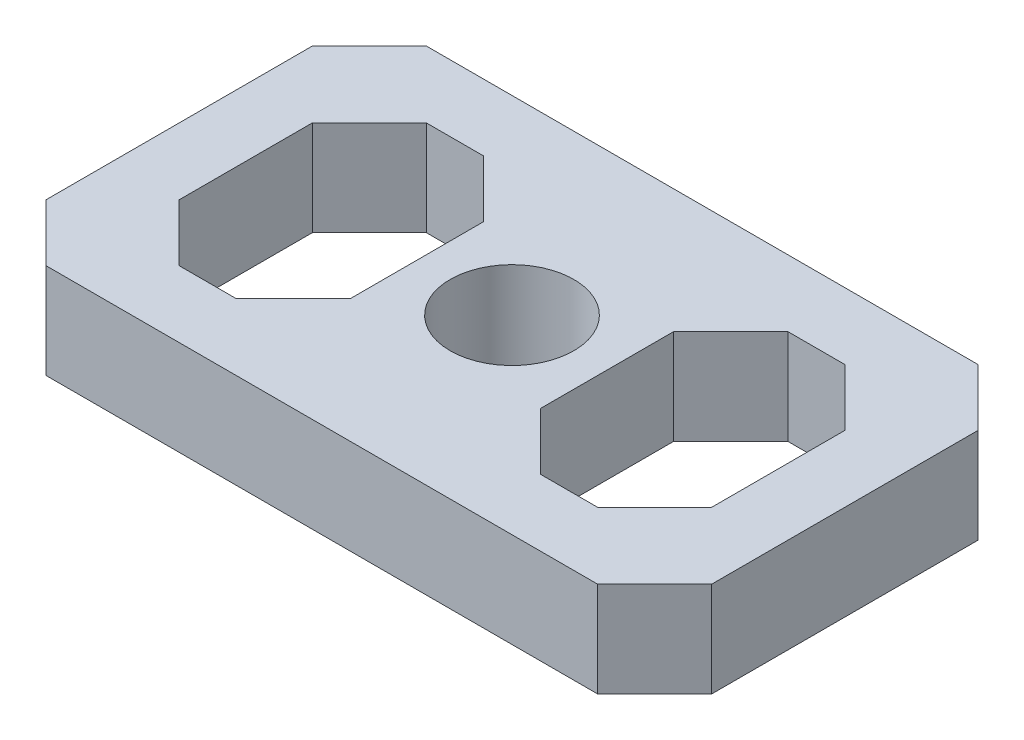
ISO-10303-21;
HEADER;
FILE_DESCRIPTION(('STEP AP214'),'2;1');
FILE_NAME('part.step','',(''),(''),'','','');
FILE_SCHEMA(('AUTOMOTIVE_DESIGN { 1 0 10303 214 1 1 1 1 }'));
ENDSEC;
DATA;
#1=APPLICATION_CONTEXT('core data for automotive mechanical design processes');
#2=APPLICATION_PROTOCOL_DEFINITION('international standard','automotive_design',2000,#1);
#3=PRODUCT_CONTEXT('',#1,'mechanical');
#4=PRODUCT('Part','Part','',(#3));
#5=PRODUCT_RELATED_PRODUCT_CATEGORY('part','',(#4));
#6=PRODUCT_DEFINITION_FORMATION('','',#4);
#7=PRODUCT_DEFINITION_CONTEXT('part definition',#1,'design');
#8=PRODUCT_DEFINITION('design','',#6,#7);
#9=PRODUCT_DEFINITION_SHAPE('','',#8);
#10=(LENGTH_UNIT() NAMED_UNIT(*) SI_UNIT(.MILLI.,.METRE.));
#11=(NAMED_UNIT(*) PLANE_ANGLE_UNIT() SI_UNIT($,.RADIAN.));
#12=(NAMED_UNIT(*) SI_UNIT($,.STERADIAN.) SOLID_ANGLE_UNIT());
#13=UNCERTAINTY_MEASURE_WITH_UNIT(LENGTH_MEASURE(1.E-05),#10,'distance_accuracy_value','');
#14=(GEOMETRIC_REPRESENTATION_CONTEXT(3) GLOBAL_UNCERTAINTY_ASSIGNED_CONTEXT((#13)) GLOBAL_UNIT_ASSIGNED_CONTEXT((#10,
#11,#12)) REPRESENTATION_CONTEXT('',''));
#15=CARTESIAN_POINT('',(0.,0.,0.));
#16=DIRECTION('',(0.,0.,1.));
#17=DIRECTION('',(1.,0.,0.));
#18=AXIS2_PLACEMENT_3D('',#15,#16,#17);
#19=CARTESIAN_POINT('',(0.,10.,0.));
#20=DIRECTION('',(0.,1.,0.));
#21=DIRECTION('',(0.,0.,1.));
#22=AXIS2_PLACEMENT_3D('',#19,#20,#21);
#23=PLANE('',#22);
#24=DIRECTION('',(-1.,0.,0.));
#25=VECTOR('',#24,1.);
#26=CARTESIAN_POINT('',(-35.,10.,-20.));
#27=LINE('',#26,#25);
#28=CARTESIAN_POINT('',(29.,10.,-20.));
#29=VERTEX_POINT('',#28);
#30=CARTESIAN_POINT('',(-29.,10.,-20.));
#31=VERTEX_POINT('',#30);
#32=EDGE_CURVE('E396',#29,#31,#27,.T.);
#33=ORIENTED_EDGE('',*,*,#32,.T.);
#34=DIRECTION('',(0.707106781186549,0.,-0.707106781186546));
#35=VECTOR('',#34,1.);
#36=CARTESIAN_POINT('',(-24.4999999999999,10.,-24.5));
#37=LINE('',#36,#35);
#38=CARTESIAN_POINT('',(-35.,10.,-14.));
#39=VERTEX_POINT('',#38);
#40=EDGE_CURVE('E250',#31,#39,#37,.F.);
#41=ORIENTED_EDGE('',*,*,#40,.T.);
#42=DIRECTION('',(0.,0.,1.));
#43=VECTOR('',#42,1.);
#44=CARTESIAN_POINT('',(-35.,10.,-20.));
#45=LINE('',#44,#43);
#46=CARTESIAN_POINT('',(-35.,10.,14.));
#47=VERTEX_POINT('',#46);
#48=EDGE_CURVE('E218',#39,#47,#45,.T.);
#49=ORIENTED_EDGE('',*,*,#48,.T.);
#50=DIRECTION('',(-0.707106781186546,0.,-0.707106781186549));
#51=VECTOR('',#50,1.);
#52=CARTESIAN_POINT('',(-24.5000000000001,10.,24.5));
#53=LINE('',#52,#51);
#54=CARTESIAN_POINT('',(-29.,10.,20.));
#55=VERTEX_POINT('',#54);
#56=EDGE_CURVE('E248',#47,#55,#53,.F.);
#57=ORIENTED_EDGE('',*,*,#56,.T.);
#58=DIRECTION('',(1.,0.,0.));
#59=VECTOR('',#58,1.);
#60=CARTESIAN_POINT('',(-35.,10.,20.));
#61=LINE('',#60,#59);
#62=CARTESIAN_POINT('',(29.,10.,20.));
#63=VERTEX_POINT('',#62);
#64=EDGE_CURVE('E235',#55,#63,#61,.T.);
#65=ORIENTED_EDGE('',*,*,#64,.T.);
#66=DIRECTION('',(-0.707106781186549,0.,0.707106781186546));
#67=VECTOR('',#66,1.);
#68=CARTESIAN_POINT('',(24.4999999999999,10.,24.5));
#69=LINE('',#68,#67);
#70=CARTESIAN_POINT('',(35.,10.,14.));
#71=VERTEX_POINT('',#70);
#72=EDGE_CURVE('E246',#63,#71,#69,.F.);
#73=ORIENTED_EDGE('',*,*,#72,.T.);
#74=DIRECTION('',(0.,0.,-1.));
#75=VECTOR('',#74,1.);
#76=CARTESIAN_POINT('',(35.,10.,-20.));
#77=LINE('',#76,#75);
#78=CARTESIAN_POINT('',(35.,10.,-14.));
#79=VERTEX_POINT('',#78);
#80=EDGE_CURVE('E229',#71,#79,#77,.T.);
#81=ORIENTED_EDGE('',*,*,#80,.T.);
#82=DIRECTION('',(0.707106781186546,0.,0.707106781186549));
#83=VECTOR('',#82,1.);
#84=CARTESIAN_POINT('',(24.5000000000001,10.,-24.5));
#85=LINE('',#84,#83);
#86=EDGE_CURVE('E244',#79,#29,#85,.F.);
#87=ORIENTED_EDGE('',*,*,#86,.T.);
#88=EDGE_LOOP('',(#33,#41,#49,#57,#65,#73,#81,#87));
#89=FACE_BOUND('',#88,.T.);
#90=CARTESIAN_POINT('',(0.,10.,0.));
#91=DIRECTION('',(0.,1.,0.));
#92=DIRECTION('',(0.,0.,1.));
#93=AXIS2_PLACEMENT_3D('',#90,#91,#92);
#94=CIRCLE('',#93,6.5);
#95=CARTESIAN_POINT('',(0.,10.,6.5));
#96=VERTEX_POINT('',#95);
#97=EDGE_CURVE('E389',#96,#96,#94,.T.);
#98=ORIENTED_EDGE('',*,*,#97,.F.);
#99=EDGE_LOOP('',(#98));
#100=FACE_BOUND('',#99,.T.);
#101=DIRECTION('',(-1.,0.,0.));
#102=VECTOR('',#101,1.);
#103=CARTESIAN_POINT('',(-28.,10.,-13.));
#104=LINE('',#103,#102);
#105=CARTESIAN_POINT('',(-16.,10.,-13.));
#106=VERTEX_POINT('',#105);
#107=CARTESIAN_POINT('',(-22.,10.,-13.));
#108=VERTEX_POINT('',#107);
#109=EDGE_CURVE('E368',#106,#108,#104,.T.);
#110=ORIENTED_EDGE('',*,*,#109,.F.);
#111=DIRECTION('',(-0.707106781186544,0.,-0.707106781186551));
#112=VECTOR('',#111,1.);
#113=CARTESIAN_POINT('',(-10.,10.,-6.99999999999997));
#114=LINE('',#113,#112);
#115=CARTESIAN_POINT('',(-10.,10.,-6.99999999999997));
#116=VERTEX_POINT('',#115);
#117=EDGE_CURVE('E307',#106,#116,#114,.F.);
#118=ORIENTED_EDGE('',*,*,#117,.T.);
#119=DIRECTION('',(0.,0.,-1.));
#120=VECTOR('',#119,1.);
#121=CARTESIAN_POINT('',(-10.,10.,-13.));
#122=LINE('',#121,#120);
#123=CARTESIAN_POINT('',(-10.,10.,7.00000000000001));
#124=VERTEX_POINT('',#123);
#125=EDGE_CURVE('E365',#124,#116,#122,.T.);
#126=ORIENTED_EDGE('',*,*,#125,.F.);
#127=DIRECTION('',(0.707106781186551,0.,-0.707106781186544));
#128=VECTOR('',#127,1.);
#129=CARTESIAN_POINT('',(-16.,10.,13.));
#130=LINE('',#129,#128);
#131=CARTESIAN_POINT('',(-16.,10.,13.));
#132=VERTEX_POINT('',#131);
#133=EDGE_CURVE('E311',#124,#132,#130,.F.);
#134=ORIENTED_EDGE('',*,*,#133,.T.);
#135=DIRECTION('',(1.,0.,0.));
#136=VECTOR('',#135,1.);
#137=CARTESIAN_POINT('',(-28.,10.,13.));
#138=LINE('',#137,#136);
#139=CARTESIAN_POINT('',(-22.,10.,13.));
#140=VERTEX_POINT('',#139);
#141=EDGE_CURVE('E375',#140,#132,#138,.T.);
#142=ORIENTED_EDGE('',*,*,#141,.F.);
#143=DIRECTION('',(0.707106781186544,0.,0.707106781186551));
#144=VECTOR('',#143,1.);
#145=CARTESIAN_POINT('',(-28.,10.,6.99999999999997));
#146=LINE('',#145,#144);
#147=CARTESIAN_POINT('',(-28.,10.,6.99999999999997));
#148=VERTEX_POINT('',#147);
#149=EDGE_CURVE('E315',#140,#148,#146,.F.);
#150=ORIENTED_EDGE('',*,*,#149,.T.);
#151=DIRECTION('',(0.,0.,1.));
#152=VECTOR('',#151,1.);
#153=CARTESIAN_POINT('',(-28.,10.,-13.));
#154=LINE('',#153,#152);
#155=CARTESIAN_POINT('',(-28.,10.,-7.00000000000002));
#156=VERTEX_POINT('',#155);
#157=EDGE_CURVE('E372',#156,#148,#154,.T.);
#158=ORIENTED_EDGE('',*,*,#157,.F.);
#159=DIRECTION('',(-0.707106781186551,0.,0.707106781186544));
#160=VECTOR('',#159,1.);
#161=CARTESIAN_POINT('',(-22.,10.,-13.));
#162=LINE('',#161,#160);
#163=EDGE_CURVE('E303',#156,#108,#162,.F.);
#164=ORIENTED_EDGE('',*,*,#163,.T.);
#165=EDGE_LOOP('',(#110,#118,#126,#134,#142,#150,#158,#164));
#166=FACE_BOUND('',#165,.T.);
#167=DIRECTION('',(-1.,0.,0.));
#168=VECTOR('',#167,1.);
#169=CARTESIAN_POINT('',(10.,10.,-13.));
#170=LINE('',#169,#168);
#171=CARTESIAN_POINT('',(22.,10.,-13.));
#172=VERTEX_POINT('',#171);
#173=CARTESIAN_POINT('',(16.,10.,-13.));
#174=VERTEX_POINT('',#173);
#175=EDGE_CURVE('E344',#172,#174,#170,.T.);
#176=ORIENTED_EDGE('',*,*,#175,.F.);
#177=DIRECTION('',(-0.707106781186544,0.,-0.707106781186551));
#178=VECTOR('',#177,1.);
#179=CARTESIAN_POINT('',(28.,10.,-6.99999999999996));
#180=LINE('',#179,#178);
#181=CARTESIAN_POINT('',(28.,10.,-6.99999999999996));
#182=VERTEX_POINT('',#181);
#183=EDGE_CURVE('E326',#172,#182,#180,.F.);
#184=ORIENTED_EDGE('',*,*,#183,.T.);
#185=DIRECTION('',(0.,0.,-1.));
#186=VECTOR('',#185,1.);
#187=CARTESIAN_POINT('',(28.,10.,-13.));
#188=LINE('',#187,#186);
#189=CARTESIAN_POINT('',(28.,10.,7.00000000000004));
#190=VERTEX_POINT('',#189);
#191=EDGE_CURVE('E350',#190,#182,#188,.T.);
#192=ORIENTED_EDGE('',*,*,#191,.F.);
#193=DIRECTION('',(0.707106781186552,0.,-0.707106781186543));
#194=VECTOR('',#193,1.);
#195=CARTESIAN_POINT('',(22.,10.,13.));
#196=LINE('',#195,#194);
#197=CARTESIAN_POINT('',(22.,10.,13.));
#198=VERTEX_POINT('',#197);
#199=EDGE_CURVE('E322',#190,#198,#196,.F.);
#200=ORIENTED_EDGE('',*,*,#199,.T.);
#201=DIRECTION('',(1.,0.,0.));
#202=VECTOR('',#201,1.);
#203=CARTESIAN_POINT('',(10.,10.,13.));
#204=LINE('',#203,#202);
#205=CARTESIAN_POINT('',(16.,10.,13.));
#206=VERTEX_POINT('',#205);
#207=EDGE_CURVE('E352',#206,#198,#204,.T.);
#208=ORIENTED_EDGE('',*,*,#207,.F.);
#209=DIRECTION('',(0.707106781186543,0.,0.707106781186552));
#210=VECTOR('',#209,1.);
#211=CARTESIAN_POINT('',(10.,10.,6.99999999999995));
#212=LINE('',#211,#210);
#213=CARTESIAN_POINT('',(10.,10.,6.99999999999995));
#214=VERTEX_POINT('',#213);
#215=EDGE_CURVE('E51',#206,#214,#212,.F.);
#216=ORIENTED_EDGE('',*,*,#215,.T.);
#217=DIRECTION('',(0.,0.,1.));
#218=VECTOR('',#217,1.);
#219=CARTESIAN_POINT('',(10.,10.,-13.));
#220=LINE('',#219,#218);
#221=CARTESIAN_POINT('',(10.,10.,-7.00000000000003));
#222=VERTEX_POINT('',#221);
#223=EDGE_CURVE('E346',#222,#214,#220,.T.);
#224=ORIENTED_EDGE('',*,*,#223,.F.);
#225=DIRECTION('',(-0.707106781186551,0.,0.707106781186544));
#226=VECTOR('',#225,1.);
#227=CARTESIAN_POINT('',(16.,10.,-13.));
#228=LINE('',#227,#226);
#229=EDGE_CURVE('E11',#222,#174,#228,.F.);
#230=ORIENTED_EDGE('',*,*,#229,.T.);
#231=EDGE_LOOP('',(#176,#184,#192,#200,#208,#216,#224,#230));
#232=FACE_BOUND('',#231,.T.);
#233=ADVANCED_FACE('F35',(#89,#100,#166,#232),#23,.T.);
#234=CARTESIAN_POINT('',(0.,0.,0.));
#235=DIRECTION('',(0.,1.,0.));
#236=DIRECTION('',(0.,0.,1.));
#237=AXIS2_PLACEMENT_3D('',#234,#235,#236);
#238=PLANE('',#237);
#239=DIRECTION('',(1.,0.,0.));
#240=VECTOR('',#239,1.);
#241=CARTESIAN_POINT('',(-28.,0.,13.));
#242=LINE('',#241,#240);
#243=CARTESIAN_POINT('',(-22.,0.,13.));
#244=VERTEX_POINT('',#243);
#245=CARTESIAN_POINT('',(-16.,0.,13.));
#246=VERTEX_POINT('',#245);
#247=EDGE_CURVE('E369',#244,#246,#242,.T.);
#248=ORIENTED_EDGE('',*,*,#247,.T.);
#249=DIRECTION('',(-0.707106781186551,0.,0.707106781186544));
#250=VECTOR('',#249,1.);
#251=CARTESIAN_POINT('',(-1.49999999999994,0.,-1.49999999999996));
#252=LINE('',#251,#250);
#253=CARTESIAN_POINT('',(-10.,0.,7.00000000000001));
#254=VERTEX_POINT('',#253);
#255=EDGE_CURVE('E309',#246,#254,#252,.F.);
#256=ORIENTED_EDGE('',*,*,#255,.T.);
#257=DIRECTION('',(0.,0.,-1.));
#258=VECTOR('',#257,1.);
#259=CARTESIAN_POINT('',(-10.,0.,-13.));
#260=LINE('',#259,#258);
#261=CARTESIAN_POINT('',(-10.,0.,-6.99999999999997));
#262=VERTEX_POINT('',#261);
#263=EDGE_CURVE('E359',#254,#262,#260,.T.);
#264=ORIENTED_EDGE('',*,*,#263,.T.);
#265=DIRECTION('',(0.707106781186544,0.,0.707106781186551));
#266=VECTOR('',#265,1.);
#267=CARTESIAN_POINT('',(-1.50000000000006,0.,1.50000000000005));
#268=LINE('',#267,#266);
#269=CARTESIAN_POINT('',(-16.,0.,-13.));
#270=VERTEX_POINT('',#269);
#271=EDGE_CURVE('E305',#262,#270,#268,.F.);
#272=ORIENTED_EDGE('',*,*,#271,.T.);
#273=DIRECTION('',(-1.,0.,0.));
#274=VECTOR('',#273,1.);
#275=CARTESIAN_POINT('',(-28.,0.,-13.));
#276=LINE('',#275,#274);
#277=CARTESIAN_POINT('',(-22.,0.,-13.));
#278=VERTEX_POINT('',#277);
#279=EDGE_CURVE('E381',#270,#278,#276,.T.);
#280=ORIENTED_EDGE('',*,*,#279,.T.);
#281=DIRECTION('',(0.707106781186551,0.,-0.707106781186544));
#282=VECTOR('',#281,1.);
#283=CARTESIAN_POINT('',(-17.4999999999999,0.,-17.5));
#284=LINE('',#283,#282);
#285=CARTESIAN_POINT('',(-28.,0.,-7.00000000000002));
#286=VERTEX_POINT('',#285);
#287=EDGE_CURVE('E301',#278,#286,#284,.F.);
#288=ORIENTED_EDGE('',*,*,#287,.T.);
#289=DIRECTION('',(0.,0.,1.));
#290=VECTOR('',#289,1.);
#291=CARTESIAN_POINT('',(-28.,0.,-13.));
#292=LINE('',#291,#290);
#293=CARTESIAN_POINT('',(-28.,0.,6.99999999999997));
#294=VERTEX_POINT('',#293);
#295=EDGE_CURVE('E384',#286,#294,#292,.T.);
#296=ORIENTED_EDGE('',*,*,#295,.T.);
#297=DIRECTION('',(-0.707106781186544,0.,-0.707106781186551));
#298=VECTOR('',#297,1.);
#299=CARTESIAN_POINT('',(-17.5000000000001,0.,17.5));
#300=LINE('',#299,#298);
#301=EDGE_CURVE('E313',#294,#244,#300,.F.);
#302=ORIENTED_EDGE('',*,*,#301,.T.);
#303=EDGE_LOOP('',(#248,#256,#264,#272,#280,#288,#296,#302));
#304=FACE_BOUND('',#303,.T.);
#305=DIRECTION('',(0.,0.,1.));
#306=VECTOR('',#305,1.);
#307=CARTESIAN_POINT('',(-35.,0.,-20.));
#308=LINE('',#307,#306);
#309=CARTESIAN_POINT('',(-35.,0.,-14.));
#310=VERTEX_POINT('',#309);
#311=CARTESIAN_POINT('',(-35.,0.,14.));
#312=VERTEX_POINT('',#311);
#313=EDGE_CURVE('E215',#310,#312,#308,.T.);
#314=ORIENTED_EDGE('',*,*,#313,.F.);
#315=DIRECTION('',(-0.707106781186549,0.,0.707106781186546));
#316=VECTOR('',#315,1.);
#317=CARTESIAN_POINT('',(-35.,0.,-14.));
#318=LINE('',#317,#316);
#319=CARTESIAN_POINT('',(-29.,0.,-20.));
#320=VERTEX_POINT('',#319);
#321=EDGE_CURVE('E198',#310,#320,#318,.F.);
#322=ORIENTED_EDGE('',*,*,#321,.T.);
#323=DIRECTION('',(-1.,0.,0.));
#324=VECTOR('',#323,1.);
#325=CARTESIAN_POINT('',(-35.,0.,-20.));
#326=LINE('',#325,#324);
#327=CARTESIAN_POINT('',(29.,0.,-20.));
#328=VERTEX_POINT('',#327);
#329=EDGE_CURVE('E226',#328,#320,#326,.T.);
#330=ORIENTED_EDGE('',*,*,#329,.F.);
#331=DIRECTION('',(-0.707106781186546,0.,-0.707106781186549));
#332=VECTOR('',#331,1.);
#333=CARTESIAN_POINT('',(29.,0.,-20.));
#334=LINE('',#333,#332);
#335=CARTESIAN_POINT('',(35.,0.,-14.));
#336=VERTEX_POINT('',#335);
#337=EDGE_CURVE('E219',#328,#336,#334,.F.);
#338=ORIENTED_EDGE('',*,*,#337,.T.);
#339=DIRECTION('',(0.,0.,-1.));
#340=VECTOR('',#339,1.);
#341=CARTESIAN_POINT('',(35.,0.,-20.));
#342=LINE('',#341,#340);
#343=CARTESIAN_POINT('',(35.,0.,14.));
#344=VERTEX_POINT('',#343);
#345=EDGE_CURVE('E231',#344,#336,#342,.T.);
#346=ORIENTED_EDGE('',*,*,#345,.F.);
#347=DIRECTION('',(0.707106781186549,0.,-0.707106781186546));
#348=VECTOR('',#347,1.);
#349=CARTESIAN_POINT('',(35.,0.,14.));
#350=LINE('',#349,#348);
#351=CARTESIAN_POINT('',(29.,0.,20.));
#352=VERTEX_POINT('',#351);
#353=EDGE_CURVE('E238',#344,#352,#350,.F.);
#354=ORIENTED_EDGE('',*,*,#353,.T.);
#355=DIRECTION('',(1.,0.,0.));
#356=VECTOR('',#355,1.);
#357=CARTESIAN_POINT('',(-35.,0.,20.));
#358=LINE('',#357,#356);
#359=CARTESIAN_POINT('',(-29.,0.,20.));
#360=VERTEX_POINT('',#359);
#361=EDGE_CURVE('E225',#360,#352,#358,.T.);
#362=ORIENTED_EDGE('',*,*,#361,.F.);
#363=DIRECTION('',(0.707106781186546,0.,0.707106781186549));
#364=VECTOR('',#363,1.);
#365=CARTESIAN_POINT('',(-29.,0.,20.));
#366=LINE('',#365,#364);
#367=EDGE_CURVE('E209',#360,#312,#366,.F.);
#368=ORIENTED_EDGE('',*,*,#367,.T.);
#369=EDGE_LOOP('',(#314,#322,#330,#338,#346,#354,#362,#368));
#370=FACE_BOUND('',#369,.T.);
#371=CARTESIAN_POINT('',(0.,0.,0.));
#372=DIRECTION('',(0.,1.,0.));
#373=DIRECTION('',(0.,0.,1.));
#374=AXIS2_PLACEMENT_3D('',#371,#372,#373);
#375=CIRCLE('',#374,6.5);
#376=CARTESIAN_POINT('',(0.,0.,6.5));
#377=VERTEX_POINT('',#376);
#378=EDGE_CURVE('E378',#377,#377,#375,.T.);
#379=ORIENTED_EDGE('',*,*,#378,.T.);
#380=EDGE_LOOP('',(#379));
#381=FACE_BOUND('',#380,.T.);
#382=DIRECTION('',(1.,0.,0.));
#383=VECTOR('',#382,1.);
#384=CARTESIAN_POINT('',(10.,0.,13.));
#385=LINE('',#384,#383);
#386=CARTESIAN_POINT('',(16.,0.,13.));
#387=VERTEX_POINT('',#386);
#388=CARTESIAN_POINT('',(22.,0.,13.));
#389=VERTEX_POINT('',#388);
#390=EDGE_CURVE('E338',#387,#389,#385,.T.);
#391=ORIENTED_EDGE('',*,*,#390,.T.);
#392=DIRECTION('',(-0.707106781186552,0.,0.707106781186543));
#393=VECTOR('',#392,1.);
#394=CARTESIAN_POINT('',(17.4999999999999,0.,17.5000000000001));
#395=LINE('',#394,#393);
#396=CARTESIAN_POINT('',(28.,0.,7.00000000000004));
#397=VERTEX_POINT('',#396);
#398=EDGE_CURVE('E320',#389,#397,#395,.F.);
#399=ORIENTED_EDGE('',*,*,#398,.T.);
#400=DIRECTION('',(0.,0.,-1.));
#401=VECTOR('',#400,1.);
#402=CARTESIAN_POINT('',(28.,0.,-13.));
#403=LINE('',#402,#401);
#404=CARTESIAN_POINT('',(28.,0.,-6.99999999999996));
#405=VERTEX_POINT('',#404);
#406=EDGE_CURVE('E360',#397,#405,#403,.T.);
#407=ORIENTED_EDGE('',*,*,#406,.T.);
#408=DIRECTION('',(0.707106781186544,0.,0.707106781186551));
#409=VECTOR('',#408,1.);
#410=CARTESIAN_POINT('',(17.5000000000001,0.,-17.4999999999999));
#411=LINE('',#410,#409);
#412=CARTESIAN_POINT('',(22.,0.,-13.));
#413=VERTEX_POINT('',#412);
#414=EDGE_CURVE('E324',#405,#413,#411,.F.);
#415=ORIENTED_EDGE('',*,*,#414,.T.);
#416=DIRECTION('',(-1.,0.,0.));
#417=VECTOR('',#416,1.);
#418=CARTESIAN_POINT('',(10.,0.,-13.));
#419=LINE('',#418,#417);
#420=CARTESIAN_POINT('',(16.,0.,-13.));
#421=VERTEX_POINT('',#420);
#422=EDGE_CURVE('E333',#413,#421,#419,.T.);
#423=ORIENTED_EDGE('',*,*,#422,.T.);
#424=DIRECTION('',(0.707106781186551,0.,-0.707106781186544));
#425=VECTOR('',#424,1.);
#426=CARTESIAN_POINT('',(1.49999999999994,0.,1.49999999999996));
#427=LINE('',#426,#425);
#428=CARTESIAN_POINT('',(10.,0.,-7.00000000000003));
#429=VERTEX_POINT('',#428);
#430=EDGE_CURVE('E44',#421,#429,#427,.F.);
#431=ORIENTED_EDGE('',*,*,#430,.T.);
#432=DIRECTION('',(0.,0.,1.));
#433=VECTOR('',#432,1.);
#434=CARTESIAN_POINT('',(10.,0.,-13.));
#435=LINE('',#434,#433);
#436=CARTESIAN_POINT('',(10.,0.,6.99999999999995));
#437=VERTEX_POINT('',#436);
#438=EDGE_CURVE('E331',#429,#437,#435,.T.);
#439=ORIENTED_EDGE('',*,*,#438,.T.);
#440=DIRECTION('',(-0.707106781186543,0.,-0.707106781186552));
#441=VECTOR('',#440,1.);
#442=CARTESIAN_POINT('',(1.50000000000009,0.,-1.50000000000007));
#443=LINE('',#442,#441);
#444=EDGE_CURVE('E317',#437,#387,#443,.F.);
#445=ORIENTED_EDGE('',*,*,#444,.T.);
#446=EDGE_LOOP('',(#391,#399,#407,#415,#423,#431,#439,#445));
#447=FACE_BOUND('',#446,.T.);
#448=ADVANCED_FACE('F222',(#304,#370,#381,#447),#238,.F.);
#449=CARTESIAN_POINT('',(35.,10.,-20.));
#450=DIRECTION('',(-1.,0.,0.));
#451=DIRECTION('',(0.,0.,1.));
#452=AXIS2_PLACEMENT_3D('',#449,#450,#451);
#453=PLANE('',#452);
#454=ORIENTED_EDGE('',*,*,#80,.F.);
#455=DIRECTION('',(0.,-1.,0.));
#456=VECTOR('',#455,1.);
#457=CARTESIAN_POINT('',(35.,10.,14.));
#458=LINE('',#457,#456);
#459=EDGE_CURVE('E298',#71,#344,#458,.T.);
#460=ORIENTED_EDGE('',*,*,#459,.T.);
#461=ORIENTED_EDGE('',*,*,#345,.T.);
#462=DIRECTION('',(0.,1.,0.));
#463=VECTOR('',#462,1.);
#464=CARTESIAN_POINT('',(35.,10.,-14.));
#465=LINE('',#464,#463);
#466=EDGE_CURVE('E296',#336,#79,#465,.T.);
#467=ORIENTED_EDGE('',*,*,#466,.T.);
#468=EDGE_LOOP('',(#454,#460,#461,#467));
#469=FACE_BOUND('',#468,.T.);
#470=ADVANCED_FACE('F406',(#469),#453,.F.);
#471=CARTESIAN_POINT('',(-35.,10.,-20.));
#472=DIRECTION('',(0.,0.,1.));
#473=DIRECTION('',(1.,0.,0.));
#474=AXIS2_PLACEMENT_3D('',#471,#472,#473);
#475=PLANE('',#474);
#476=ORIENTED_EDGE('',*,*,#329,.T.);
#477=DIRECTION('',(0.,1.,0.));
#478=VECTOR('',#477,1.);
#479=CARTESIAN_POINT('',(-29.,10.,-20.));
#480=LINE('',#479,#478);
#481=EDGE_CURVE('E203',#320,#31,#480,.T.);
#482=ORIENTED_EDGE('',*,*,#481,.T.);
#483=ORIENTED_EDGE('',*,*,#32,.F.);
#484=DIRECTION('',(0.,-1.,0.));
#485=VECTOR('',#484,1.);
#486=CARTESIAN_POINT('',(29.,10.,-20.));
#487=LINE('',#486,#485);
#488=EDGE_CURVE('E208',#29,#328,#487,.T.);
#489=ORIENTED_EDGE('',*,*,#488,.T.);
#490=EDGE_LOOP('',(#476,#482,#483,#489));
#491=FACE_BOUND('',#490,.T.);
#492=ADVANCED_FACE('F415',(#491),#475,.F.);
#493=CARTESIAN_POINT('',(-35.,10.,-20.));
#494=DIRECTION('',(1.,0.,0.));
#495=DIRECTION('',(0.,0.,-1.));
#496=AXIS2_PLACEMENT_3D('',#493,#494,#495);
#497=PLANE('',#496);
#498=ORIENTED_EDGE('',*,*,#48,.F.);
#499=DIRECTION('',(0.,-1.,0.));
#500=VECTOR('',#499,1.);
#501=CARTESIAN_POINT('',(-35.,10.,-14.));
#502=LINE('',#501,#500);
#503=EDGE_CURVE('E202',#39,#310,#502,.T.);
#504=ORIENTED_EDGE('',*,*,#503,.T.);
#505=ORIENTED_EDGE('',*,*,#313,.T.);
#506=DIRECTION('',(0.,1.,0.));
#507=VECTOR('',#506,1.);
#508=CARTESIAN_POINT('',(-35.,10.,14.));
#509=LINE('',#508,#507);
#510=EDGE_CURVE('E220',#312,#47,#509,.T.);
#511=ORIENTED_EDGE('',*,*,#510,.T.);
#512=EDGE_LOOP('',(#498,#504,#505,#511));
#513=FACE_BOUND('',#512,.T.);
#514=ADVANCED_FACE('F214',(#513),#497,.F.);
#515=CARTESIAN_POINT('',(-35.,10.,20.));
#516=DIRECTION('',(0.,0.,-1.));
#517=DIRECTION('',(-1.,0.,0.));
#518=AXIS2_PLACEMENT_3D('',#515,#516,#517);
#519=PLANE('',#518);
#520=ORIENTED_EDGE('',*,*,#64,.F.);
#521=DIRECTION('',(0.,-1.,0.));
#522=VECTOR('',#521,1.);
#523=CARTESIAN_POINT('',(-29.,10.,20.));
#524=LINE('',#523,#522);
#525=EDGE_CURVE('E254',#55,#360,#524,.T.);
#526=ORIENTED_EDGE('',*,*,#525,.T.);
#527=ORIENTED_EDGE('',*,*,#361,.T.);
#528=DIRECTION('',(0.,1.,0.));
#529=VECTOR('',#528,1.);
#530=CARTESIAN_POINT('',(29.,10.,20.));
#531=LINE('',#530,#529);
#532=EDGE_CURVE('E252',#352,#63,#531,.T.);
#533=ORIENTED_EDGE('',*,*,#532,.T.);
#534=EDGE_LOOP('',(#520,#526,#527,#533));
#535=FACE_BOUND('',#534,.T.);
#536=ADVANCED_FACE('F422',(#535),#519,.F.);
#537=CARTESIAN_POINT('',(0.,10.,0.));
#538=DIRECTION('',(0.,-1.,0.));
#539=DIRECTION('',(0.,0.,-1.));
#540=AXIS2_PLACEMENT_3D('',#537,#538,#539);
#541=CYLINDRICAL_SURFACE('',#540,6.5);
#542=ORIENTED_EDGE('',*,*,#97,.T.);
#543=EDGE_LOOP('',(#542));
#544=FACE_BOUND('',#543,.T.);
#545=ORIENTED_EDGE('',*,*,#378,.F.);
#546=EDGE_LOOP('',(#545));
#547=FACE_BOUND('',#546,.T.);
#548=ADVANCED_FACE('F433',(#544,#547),#541,.F.);
#549=CARTESIAN_POINT('',(-10.,10.,-13.));
#550=DIRECTION('',(-1.,0.,0.));
#551=DIRECTION('',(0.,0.,1.));
#552=AXIS2_PLACEMENT_3D('',#549,#550,#551);
#553=PLANE('',#552);
#554=ORIENTED_EDGE('',*,*,#125,.T.);
#555=DIRECTION('',(0.,-1.,0.));
#556=VECTOR('',#555,1.);
#557=CARTESIAN_POINT('',(-10.,0.,-6.99999999999997));
#558=LINE('',#557,#556);
#559=EDGE_CURVE('E269',#116,#262,#558,.T.);
#560=ORIENTED_EDGE('',*,*,#559,.T.);
#561=ORIENTED_EDGE('',*,*,#263,.F.);
#562=DIRECTION('',(0.,1.,0.));
#563=VECTOR('',#562,1.);
#564=CARTESIAN_POINT('',(-10.,10.,7.00000000000001));
#565=LINE('',#564,#563);
#566=EDGE_CURVE('E267',#254,#124,#565,.T.);
#567=ORIENTED_EDGE('',*,*,#566,.T.);
#568=EDGE_LOOP('',(#554,#560,#561,#567));
#569=FACE_BOUND('',#568,.T.);
#570=ADVANCED_FACE('F441',(#569),#553,.T.);
#571=CARTESIAN_POINT('',(-28.,10.,-13.));
#572=DIRECTION('',(0.,0.,1.));
#573=DIRECTION('',(1.,0.,0.));
#574=AXIS2_PLACEMENT_3D('',#571,#572,#573);
#575=PLANE('',#574);
#576=ORIENTED_EDGE('',*,*,#109,.T.);
#577=DIRECTION('',(0.,-1.,0.));
#578=VECTOR('',#577,1.);
#579=CARTESIAN_POINT('',(-22.,0.,-13.));
#580=LINE('',#579,#578);
#581=EDGE_CURVE('E259',#108,#278,#580,.T.);
#582=ORIENTED_EDGE('',*,*,#581,.T.);
#583=ORIENTED_EDGE('',*,*,#279,.F.);
#584=DIRECTION('',(0.,1.,0.));
#585=VECTOR('',#584,1.);
#586=CARTESIAN_POINT('',(-16.,10.,-13.));
#587=LINE('',#586,#585);
#588=EDGE_CURVE('E257',#270,#106,#587,.T.);
#589=ORIENTED_EDGE('',*,*,#588,.T.);
#590=EDGE_LOOP('',(#576,#582,#583,#589));
#591=FACE_BOUND('',#590,.T.);
#592=ADVANCED_FACE('F643',(#591),#575,.T.);
#593=CARTESIAN_POINT('',(-28.,10.,-13.));
#594=DIRECTION('',(1.,0.,0.));
#595=DIRECTION('',(0.,0.,-1.));
#596=AXIS2_PLACEMENT_3D('',#593,#594,#595);
#597=PLANE('',#596);
#598=ORIENTED_EDGE('',*,*,#295,.F.);
#599=DIRECTION('',(0.,1.,0.));
#600=VECTOR('',#599,1.);
#601=CARTESIAN_POINT('',(-28.,10.,-7.00000000000002));
#602=LINE('',#601,#600);
#603=EDGE_CURVE('E265',#286,#156,#602,.T.);
#604=ORIENTED_EDGE('',*,*,#603,.T.);
#605=ORIENTED_EDGE('',*,*,#157,.T.);
#606=DIRECTION('',(0.,-1.,0.));
#607=VECTOR('',#606,1.);
#608=CARTESIAN_POINT('',(-28.,0.,6.99999999999997));
#609=LINE('',#608,#607);
#610=EDGE_CURVE('E262',#148,#294,#609,.T.);
#611=ORIENTED_EDGE('',*,*,#610,.T.);
#612=EDGE_LOOP('',(#598,#604,#605,#611));
#613=FACE_BOUND('',#612,.T.);
#614=ADVANCED_FACE('F633',(#613),#597,.T.);
#615=CARTESIAN_POINT('',(-28.,10.,13.));
#616=DIRECTION('',(0.,0.,-1.));
#617=DIRECTION('',(-1.,0.,0.));
#618=AXIS2_PLACEMENT_3D('',#615,#616,#617);
#619=PLANE('',#618);
#620=ORIENTED_EDGE('',*,*,#141,.T.);
#621=DIRECTION('',(0.,-1.,0.));
#622=VECTOR('',#621,1.);
#623=CARTESIAN_POINT('',(-16.,0.,13.));
#624=LINE('',#623,#622);
#625=EDGE_CURVE('E274',#132,#246,#624,.T.);
#626=ORIENTED_EDGE('',*,*,#625,.T.);
#627=ORIENTED_EDGE('',*,*,#247,.F.);
#628=DIRECTION('',(0.,1.,0.));
#629=VECTOR('',#628,1.);
#630=CARTESIAN_POINT('',(-22.,10.,13.));
#631=LINE('',#630,#629);
#632=EDGE_CURVE('E272',#244,#140,#631,.T.);
#633=ORIENTED_EDGE('',*,*,#632,.T.);
#634=EDGE_LOOP('',(#620,#626,#627,#633));
#635=FACE_BOUND('',#634,.T.);
#636=ADVANCED_FACE('F623',(#635),#619,.T.);
#637=CARTESIAN_POINT('',(28.,10.,-13.));
#638=DIRECTION('',(-1.,0.,0.));
#639=DIRECTION('',(0.,0.,1.));
#640=AXIS2_PLACEMENT_3D('',#637,#638,#639);
#641=PLANE('',#640);
#642=ORIENTED_EDGE('',*,*,#406,.F.);
#643=DIRECTION('',(0.,1.,0.));
#644=VECTOR('',#643,1.);
#645=CARTESIAN_POINT('',(28.,10.,7.00000000000004));
#646=LINE('',#645,#644);
#647=EDGE_CURVE('E289',#397,#190,#646,.T.);
#648=ORIENTED_EDGE('',*,*,#647,.T.);
#649=ORIENTED_EDGE('',*,*,#191,.T.);
#650=DIRECTION('',(0.,-1.,0.));
#651=VECTOR('',#650,1.);
#652=CARTESIAN_POINT('',(28.,0.,-6.99999999999996));
#653=LINE('',#652,#651);
#654=EDGE_CURVE('E286',#182,#405,#653,.T.);
#655=ORIENTED_EDGE('',*,*,#654,.T.);
#656=EDGE_LOOP('',(#642,#648,#649,#655));
#657=FACE_BOUND('',#656,.T.);
#658=ADVANCED_FACE('F614',(#657),#641,.T.);
#659=CARTESIAN_POINT('',(10.,10.,-13.));
#660=DIRECTION('',(0.,0.,1.));
#661=DIRECTION('',(1.,0.,0.));
#662=AXIS2_PLACEMENT_3D('',#659,#660,#661);
#663=PLANE('',#662);
#664=ORIENTED_EDGE('',*,*,#422,.F.);
#665=DIRECTION('',(0.,1.,0.));
#666=VECTOR('',#665,1.);
#667=CARTESIAN_POINT('',(22.,10.,-13.));
#668=LINE('',#667,#666);
#669=EDGE_CURVE('E294',#413,#172,#668,.T.);
#670=ORIENTED_EDGE('',*,*,#669,.T.);
#671=ORIENTED_EDGE('',*,*,#175,.T.);
#672=DIRECTION('',(0.,-1.,0.));
#673=VECTOR('',#672,1.);
#674=CARTESIAN_POINT('',(16.,0.,-13.));
#675=LINE('',#674,#673);
#676=EDGE_CURVE('E291',#174,#421,#675,.T.);
#677=ORIENTED_EDGE('',*,*,#676,.T.);
#678=EDGE_LOOP('',(#664,#670,#671,#677));
#679=FACE_BOUND('',#678,.T.);
#680=ADVANCED_FACE('F348',(#679),#663,.T.);
#681=CARTESIAN_POINT('',(10.,10.,-13.));
#682=DIRECTION('',(1.,0.,0.));
#683=DIRECTION('',(0.,0.,-1.));
#684=AXIS2_PLACEMENT_3D('',#681,#682,#683);
#685=PLANE('',#684);
#686=ORIENTED_EDGE('',*,*,#223,.T.);
#687=DIRECTION('',(0.,-1.,0.));
#688=VECTOR('',#687,1.);
#689=CARTESIAN_POINT('',(10.,0.,6.99999999999995));
#690=LINE('',#689,#688);
#691=EDGE_CURVE('E278',#214,#437,#690,.T.);
#692=ORIENTED_EDGE('',*,*,#691,.T.);
#693=ORIENTED_EDGE('',*,*,#438,.F.);
#694=DIRECTION('',(0.,1.,0.));
#695=VECTOR('',#694,1.);
#696=CARTESIAN_POINT('',(10.,10.,-7.00000000000003));
#697=LINE('',#696,#695);
#698=EDGE_CURVE('E58',#429,#222,#697,.T.);
#699=ORIENTED_EDGE('',*,*,#698,.T.);
#700=EDGE_LOOP('',(#686,#692,#693,#699));
#701=FACE_BOUND('',#700,.T.);
#702=ADVANCED_FACE('F336',(#701),#685,.T.);
#703=CARTESIAN_POINT('',(10.,10.,13.));
#704=DIRECTION('',(0.,0.,-1.));
#705=DIRECTION('',(-1.,0.,0.));
#706=AXIS2_PLACEMENT_3D('',#703,#704,#705);
#707=PLANE('',#706);
#708=ORIENTED_EDGE('',*,*,#390,.F.);
#709=DIRECTION('',(0.,1.,0.));
#710=VECTOR('',#709,1.);
#711=CARTESIAN_POINT('',(16.,10.,13.));
#712=LINE('',#711,#710);
#713=EDGE_CURVE('E284',#387,#206,#712,.T.);
#714=ORIENTED_EDGE('',*,*,#713,.T.);
#715=ORIENTED_EDGE('',*,*,#207,.T.);
#716=DIRECTION('',(0.,-1.,0.));
#717=VECTOR('',#716,1.);
#718=CARTESIAN_POINT('',(22.,0.,13.));
#719=LINE('',#718,#717);
#720=EDGE_CURVE('E281',#198,#389,#719,.T.);
#721=ORIENTED_EDGE('',*,*,#720,.T.);
#722=EDGE_LOOP('',(#708,#714,#715,#721));
#723=FACE_BOUND('',#722,.T.);
#724=ADVANCED_FACE('F460',(#723),#707,.T.);
#725=CARTESIAN_POINT('',(-35.,10.,-14.));
#726=DIRECTION('',(0.707106781186546,0.,0.707106781186549));
#727=DIRECTION('',(0.,-1.,0.));
#728=AXIS2_PLACEMENT_3D('',#725,#726,#727);
#729=PLANE('',#728);
#730=ORIENTED_EDGE('',*,*,#40,.F.);
#731=ORIENTED_EDGE('',*,*,#481,.F.);
#732=ORIENTED_EDGE('',*,*,#321,.F.);
#733=ORIENTED_EDGE('',*,*,#503,.F.);
#734=EDGE_LOOP('',(#730,#731,#732,#733));
#735=FACE_BOUND('',#734,.T.);
#736=ADVANCED_FACE('F201',(#735),#729,.F.);
#737=CARTESIAN_POINT('',(-29.,10.,20.));
#738=DIRECTION('',(0.707106781186549,0.,-0.707106781186546));
#739=DIRECTION('',(0.,-1.,0.));
#740=AXIS2_PLACEMENT_3D('',#737,#738,#739);
#741=PLANE('',#740);
#742=ORIENTED_EDGE('',*,*,#56,.F.);
#743=ORIENTED_EDGE('',*,*,#510,.F.);
#744=ORIENTED_EDGE('',*,*,#367,.F.);
#745=ORIENTED_EDGE('',*,*,#525,.F.);
#746=EDGE_LOOP('',(#742,#743,#744,#745));
#747=FACE_BOUND('',#746,.T.);
#748=ADVANCED_FACE('F449',(#747),#741,.F.);
#749=CARTESIAN_POINT('',(-22.,10.,-13.));
#750=DIRECTION('',(0.707106781186544,0.,0.707106781186551));
#751=DIRECTION('',(0.,1.,0.));
#752=AXIS2_PLACEMENT_3D('',#749,#750,#751);
#753=PLANE('',#752);
#754=ORIENTED_EDGE('',*,*,#163,.F.);
#755=ORIENTED_EDGE('',*,*,#603,.F.);
#756=ORIENTED_EDGE('',*,*,#287,.F.);
#757=ORIENTED_EDGE('',*,*,#581,.F.);
#758=EDGE_LOOP('',(#754,#755,#756,#757));
#759=FACE_BOUND('',#758,.T.);
#760=ADVANCED_FACE('F451',(#759),#753,.T.);
#761=CARTESIAN_POINT('',(-10.,10.,-6.99999999999997));
#762=DIRECTION('',(-0.707106781186551,0.,0.707106781186544));
#763=DIRECTION('',(0.,1.,0.));
#764=AXIS2_PLACEMENT_3D('',#761,#762,#763);
#765=PLANE('',#764);
#766=ORIENTED_EDGE('',*,*,#117,.F.);
#767=ORIENTED_EDGE('',*,*,#588,.F.);
#768=ORIENTED_EDGE('',*,*,#271,.F.);
#769=ORIENTED_EDGE('',*,*,#559,.F.);
#770=EDGE_LOOP('',(#766,#767,#768,#769));
#771=FACE_BOUND('',#770,.T.);
#772=ADVANCED_FACE('F457',(#771),#765,.T.);
#773=CARTESIAN_POINT('',(-16.,10.,13.));
#774=DIRECTION('',(-0.707106781186544,0.,-0.707106781186551));
#775=DIRECTION('',(0.,1.,0.));
#776=AXIS2_PLACEMENT_3D('',#773,#774,#775);
#777=PLANE('',#776);
#778=ORIENTED_EDGE('',*,*,#133,.F.);
#779=ORIENTED_EDGE('',*,*,#566,.F.);
#780=ORIENTED_EDGE('',*,*,#255,.F.);
#781=ORIENTED_EDGE('',*,*,#625,.F.);
#782=EDGE_LOOP('',(#778,#779,#780,#781));
#783=FACE_BOUND('',#782,.T.);
#784=ADVANCED_FACE('F476',(#783),#777,.T.);
#785=CARTESIAN_POINT('',(-28.,10.,6.99999999999997));
#786=DIRECTION('',(0.707106781186551,0.,-0.707106781186544));
#787=DIRECTION('',(0.,1.,0.));
#788=AXIS2_PLACEMENT_3D('',#785,#786,#787);
#789=PLANE('',#788);
#790=ORIENTED_EDGE('',*,*,#149,.F.);
#791=ORIENTED_EDGE('',*,*,#632,.F.);
#792=ORIENTED_EDGE('',*,*,#301,.F.);
#793=ORIENTED_EDGE('',*,*,#610,.F.);
#794=EDGE_LOOP('',(#790,#791,#792,#793));
#795=FACE_BOUND('',#794,.T.);
#796=ADVANCED_FACE('F483',(#795),#789,.T.);
#797=CARTESIAN_POINT('',(10.,10.,6.99999999999995));
#798=DIRECTION('',(0.707106781186552,0.,-0.707106781186543));
#799=DIRECTION('',(0.,1.,0.));
#800=AXIS2_PLACEMENT_3D('',#797,#798,#799);
#801=PLANE('',#800);
#802=ORIENTED_EDGE('',*,*,#215,.F.);
#803=ORIENTED_EDGE('',*,*,#713,.F.);
#804=ORIENTED_EDGE('',*,*,#444,.F.);
#805=ORIENTED_EDGE('',*,*,#691,.F.);
#806=EDGE_LOOP('',(#802,#803,#804,#805));
#807=FACE_BOUND('',#806,.T.);
#808=ADVANCED_FACE('F490',(#807),#801,.T.);
#809=CARTESIAN_POINT('',(22.,10.,13.));
#810=DIRECTION('',(-0.707106781186543,0.,-0.707106781186552));
#811=DIRECTION('',(0.,1.,0.));
#812=AXIS2_PLACEMENT_3D('',#809,#810,#811);
#813=PLANE('',#812);
#814=ORIENTED_EDGE('',*,*,#199,.F.);
#815=ORIENTED_EDGE('',*,*,#647,.F.);
#816=ORIENTED_EDGE('',*,*,#398,.F.);
#817=ORIENTED_EDGE('',*,*,#720,.F.);
#818=EDGE_LOOP('',(#814,#815,#816,#817));
#819=FACE_BOUND('',#818,.T.);
#820=ADVANCED_FACE('F497',(#819),#813,.T.);
#821=CARTESIAN_POINT('',(28.,10.,-6.99999999999996));
#822=DIRECTION('',(-0.707106781186551,0.,0.707106781186544));
#823=DIRECTION('',(0.,1.,0.));
#824=AXIS2_PLACEMENT_3D('',#821,#822,#823);
#825=PLANE('',#824);
#826=ORIENTED_EDGE('',*,*,#183,.F.);
#827=ORIENTED_EDGE('',*,*,#669,.F.);
#828=ORIENTED_EDGE('',*,*,#414,.F.);
#829=ORIENTED_EDGE('',*,*,#654,.F.);
#830=EDGE_LOOP('',(#826,#827,#828,#829));
#831=FACE_BOUND('',#830,.T.);
#832=ADVANCED_FACE('F504',(#831),#825,.T.);
#833=CARTESIAN_POINT('',(16.,10.,-13.));
#834=DIRECTION('',(0.707106781186544,0.,0.707106781186551));
#835=DIRECTION('',(0.,1.,0.));
#836=AXIS2_PLACEMENT_3D('',#833,#834,#835);
#837=PLANE('',#836);
#838=ORIENTED_EDGE('',*,*,#229,.F.);
#839=ORIENTED_EDGE('',*,*,#698,.F.);
#840=ORIENTED_EDGE('',*,*,#430,.F.);
#841=ORIENTED_EDGE('',*,*,#676,.F.);
#842=EDGE_LOOP('',(#838,#839,#840,#841));
#843=FACE_BOUND('',#842,.T.);
#844=ADVANCED_FACE('F341',(#843),#837,.T.);
#845=CARTESIAN_POINT('',(35.,10.,14.));
#846=DIRECTION('',(-0.707106781186546,0.,-0.707106781186549));
#847=DIRECTION('',(0.,-1.,0.));
#848=AXIS2_PLACEMENT_3D('',#845,#846,#847);
#849=PLANE('',#848);
#850=ORIENTED_EDGE('',*,*,#72,.F.);
#851=ORIENTED_EDGE('',*,*,#532,.F.);
#852=ORIENTED_EDGE('',*,*,#353,.F.);
#853=ORIENTED_EDGE('',*,*,#459,.F.);
#854=EDGE_LOOP('',(#850,#851,#852,#853));
#855=FACE_BOUND('',#854,.T.);
#856=ADVANCED_FACE('F516',(#855),#849,.F.);
#857=CARTESIAN_POINT('',(29.,10.,-20.));
#858=DIRECTION('',(-0.707106781186549,0.,0.707106781186546));
#859=DIRECTION('',(0.,-1.,0.));
#860=AXIS2_PLACEMENT_3D('',#857,#858,#859);
#861=PLANE('',#860);
#862=ORIENTED_EDGE('',*,*,#86,.F.);
#863=ORIENTED_EDGE('',*,*,#466,.F.);
#864=ORIENTED_EDGE('',*,*,#337,.F.);
#865=ORIENTED_EDGE('',*,*,#488,.F.);
#866=EDGE_LOOP('',(#862,#863,#864,#865));
#867=FACE_BOUND('',#866,.T.);
#868=ADVANCED_FACE('F38',(#867),#861,.F.);
#869=CLOSED_SHELL('',(#233,#448,#470,#492,#514,#536,#548,#570,#592,#614,#636,#658,#680,#702,
#724,#736,#748,#760,#772,#784,#796,#808,#820,#832,#844,#856,#868));
#870=MANIFOLD_SOLID_BREP('B2',#869);
#871=ADVANCED_BREP_SHAPE_REPRESENTATION('',(#18,#870),#14);
#872=SHAPE_DEFINITION_REPRESENTATION(#9,#871);
ENDSEC;
END-ISO-10303-21;
